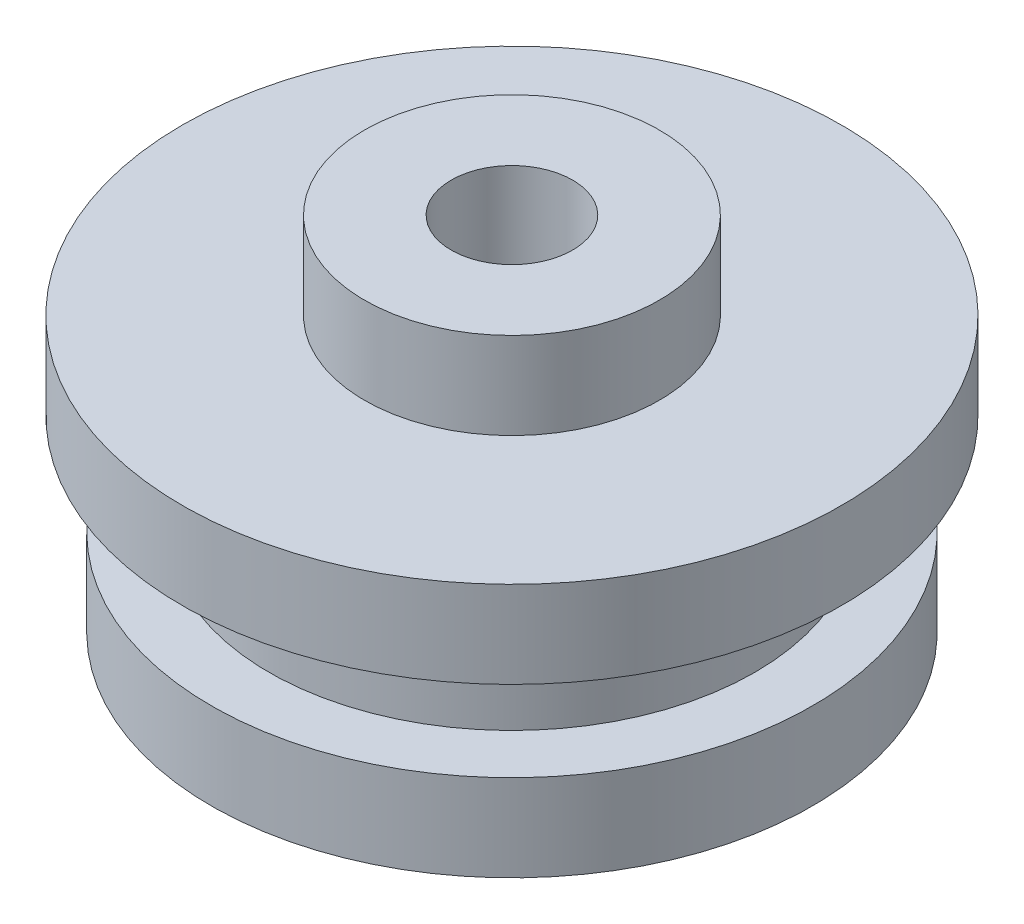
ISO-10303-21;
HEADER;
FILE_DESCRIPTION(('STEP AP214'),'2;1');
FILE_NAME('part.step','',(''),(''),'','','');
FILE_SCHEMA(('AUTOMOTIVE_DESIGN { 1 0 10303 214 1 1 1 1 }'));
ENDSEC;
DATA;
#1=APPLICATION_CONTEXT('core data for automotive mechanical design processes');
#2=APPLICATION_PROTOCOL_DEFINITION('international standard','automotive_design',2000,#1);
#3=PRODUCT_CONTEXT('',#1,'mechanical');
#4=PRODUCT('Part','Part','',(#3));
#5=PRODUCT_RELATED_PRODUCT_CATEGORY('part','',(#4));
#6=PRODUCT_DEFINITION_FORMATION('','',#4);
#7=PRODUCT_DEFINITION_CONTEXT('part definition',#1,'design');
#8=PRODUCT_DEFINITION('design','',#6,#7);
#9=PRODUCT_DEFINITION_SHAPE('','',#8);
#10=(LENGTH_UNIT() NAMED_UNIT(*) SI_UNIT(.MILLI.,.METRE.));
#11=(NAMED_UNIT(*) PLANE_ANGLE_UNIT() SI_UNIT($,.RADIAN.));
#12=(NAMED_UNIT(*) SI_UNIT($,.STERADIAN.) SOLID_ANGLE_UNIT());
#13=UNCERTAINTY_MEASURE_WITH_UNIT(LENGTH_MEASURE(1.E-05),#10,'distance_accuracy_value','');
#14=(GEOMETRIC_REPRESENTATION_CONTEXT(3) GLOBAL_UNCERTAINTY_ASSIGNED_CONTEXT((#13)) GLOBAL_UNIT_ASSIGNED_CONTEXT((#10,
#11,#12)) REPRESENTATION_CONTEXT('',''));
#15=CARTESIAN_POINT('',(0.,0.,0.));
#16=DIRECTION('',(0.,0.,1.));
#17=DIRECTION('',(1.,0.,0.));
#18=AXIS2_PLACEMENT_3D('',#15,#16,#17);
#19=CARTESIAN_POINT('',(-3.,0.,0.));
#20=DIRECTION('',(0.,1.,0.));
#21=DIRECTION('',(-1.,0.,0.));
#22=AXIS2_PLACEMENT_3D('',#19,#20,#21);
#23=PLANE('',#22);
#24=CARTESIAN_POINT('',(2.1,0.,0.));
#25=DIRECTION('',(0.,1.,0.));
#26=DIRECTION('',(-1.,0.,0.));
#27=AXIS2_PLACEMENT_3D('',#24,#25,#26);
#28=CIRCLE('',#27,5.1);
#29=CARTESIAN_POINT('',(-3.,0.,0.));
#30=VERTEX_POINT('',#29);
#31=EDGE_CURVE('E66',#30,#30,#28,.T.);
#32=ORIENTED_EDGE('',*,*,#31,.T.);
#33=EDGE_LOOP('',(#32));
#34=FACE_BOUND('',#33,.T.);
#35=CARTESIAN_POINT('',(2.1,0.,0.));
#36=DIRECTION('',(0.,1.,0.));
#37=DIRECTION('',(-1.,0.,0.));
#38=AXIS2_PLACEMENT_3D('',#35,#36,#37);
#39=CIRCLE('',#38,2.1);
#40=CARTESIAN_POINT('',(0.,0.,0.));
#41=VERTEX_POINT('',#40);
#42=EDGE_CURVE('E10',#41,#41,#39,.T.);
#43=ORIENTED_EDGE('',*,*,#42,.F.);
#44=EDGE_LOOP('',(#43));
#45=FACE_BOUND('',#44,.T.);
#46=ADVANCED_FACE('F32',(#34,#45),#23,.T.);
#47=CARTESIAN_POINT('',(2.1,0.,0.));
#48=DIRECTION('',(0.,1.,0.));
#49=DIRECTION('',(-1.,0.,0.));
#50=AXIS2_PLACEMENT_3D('',#47,#48,#49);
#51=CYLINDRICAL_SURFACE('',#50,2.1);
#52=ORIENTED_EDGE('',*,*,#42,.T.);
#53=EDGE_LOOP('',(#52));
#54=FACE_BOUND('',#53,.T.);
#55=CARTESIAN_POINT('',(2.1,-12.5,0.));
#56=DIRECTION('',(0.,1.,0.));
#57=DIRECTION('',(-1.,0.,0.));
#58=AXIS2_PLACEMENT_3D('',#55,#56,#57);
#59=CIRCLE('',#58,2.1);
#60=CARTESIAN_POINT('',(0.,-12.5,0.));
#61=VERTEX_POINT('',#60);
#62=EDGE_CURVE('E38',#61,#61,#59,.T.);
#63=ORIENTED_EDGE('',*,*,#62,.F.);
#64=EDGE_LOOP('',(#63));
#65=FACE_BOUND('',#64,.T.);
#66=ADVANCED_FACE('F84',(#54,#65),#51,.F.);
#67=CARTESIAN_POINT('',(0.,-12.5,0.));
#68=DIRECTION('',(0.,-1.,0.));
#69=DIRECTION('',(1.,0.,0.));
#70=AXIS2_PLACEMENT_3D('',#67,#68,#69);
#71=PLANE('',#70);
#72=ORIENTED_EDGE('',*,*,#62,.T.);
#73=EDGE_LOOP('',(#72));
#74=FACE_BOUND('',#73,.T.);
#75=CARTESIAN_POINT('',(2.1,-12.5,0.));
#76=DIRECTION('',(0.,1.,0.));
#77=DIRECTION('',(-1.,0.,0.));
#78=AXIS2_PLACEMENT_3D('',#75,#76,#77);
#79=CIRCLE('',#78,10.4);
#80=CARTESIAN_POINT('',(-8.3,-12.5,0.));
#81=VERTEX_POINT('',#80);
#82=EDGE_CURVE('E42',#81,#81,#79,.T.);
#83=ORIENTED_EDGE('',*,*,#82,.F.);
#84=EDGE_LOOP('',(#83));
#85=FACE_BOUND('',#84,.T.);
#86=ADVANCED_FACE('F88',(#74,#85),#71,.T.);
#87=CARTESIAN_POINT('',(2.1,0.,0.));
#88=DIRECTION('',(0.,1.,0.));
#89=DIRECTION('',(-1.,0.,0.));
#90=AXIS2_PLACEMENT_3D('',#87,#88,#89);
#91=CYLINDRICAL_SURFACE('',#90,10.4);
#92=ORIENTED_EDGE('',*,*,#82,.T.);
#93=EDGE_LOOP('',(#92));
#94=FACE_BOUND('',#93,.T.);
#95=CARTESIAN_POINT('',(2.1,-9.5,0.));
#96=DIRECTION('',(0.,1.,0.));
#97=DIRECTION('',(-1.,0.,0.));
#98=AXIS2_PLACEMENT_3D('',#95,#96,#97);
#99=CIRCLE('',#98,10.4);
#100=CARTESIAN_POINT('',(-8.3,-9.5,0.));
#101=VERTEX_POINT('',#100);
#102=EDGE_CURVE('E46',#101,#101,#99,.T.);
#103=ORIENTED_EDGE('',*,*,#102,.F.);
#104=EDGE_LOOP('',(#103));
#105=FACE_BOUND('',#104,.T.);
#106=ADVANCED_FACE('F92',(#94,#105),#91,.T.);
#107=CARTESIAN_POINT('',(-8.3,-9.5,0.));
#108=DIRECTION('',(0.,1.,0.));
#109=DIRECTION('',(-1.,0.,0.));
#110=AXIS2_PLACEMENT_3D('',#107,#108,#109);
#111=PLANE('',#110);
#112=ORIENTED_EDGE('',*,*,#102,.T.);
#113=EDGE_LOOP('',(#112));
#114=FACE_BOUND('',#113,.T.);
#115=CARTESIAN_POINT('',(2.1,-9.5,0.));
#116=DIRECTION('',(0.,1.,0.));
#117=DIRECTION('',(-1.,0.,0.));
#118=AXIS2_PLACEMENT_3D('',#115,#116,#117);
#119=CIRCLE('',#118,8.4);
#120=CARTESIAN_POINT('',(-6.3,-9.5,0.));
#121=VERTEX_POINT('',#120);
#122=EDGE_CURVE('E51',#121,#121,#119,.T.);
#123=ORIENTED_EDGE('',*,*,#122,.F.);
#124=EDGE_LOOP('',(#123));
#125=FACE_BOUND('',#124,.T.);
#126=ADVANCED_FACE('F98',(#114,#125),#111,.T.);
#127=CARTESIAN_POINT('',(2.1,0.,0.));
#128=DIRECTION('',(0.,1.,0.));
#129=DIRECTION('',(-1.,0.,0.));
#130=AXIS2_PLACEMENT_3D('',#127,#128,#129);
#131=CYLINDRICAL_SURFACE('',#130,8.4);
#132=ORIENTED_EDGE('',*,*,#122,.T.);
#133=EDGE_LOOP('',(#132));
#134=FACE_BOUND('',#133,.T.);
#135=CARTESIAN_POINT('',(2.1,-6.,0.));
#136=DIRECTION('',(0.,1.,0.));
#137=DIRECTION('',(-1.,0.,0.));
#138=AXIS2_PLACEMENT_3D('',#135,#136,#137);
#139=CIRCLE('',#138,8.4);
#140=CARTESIAN_POINT('',(-6.3,-6.,0.));
#141=VERTEX_POINT('',#140);
#142=EDGE_CURVE('E54',#141,#141,#139,.T.);
#143=ORIENTED_EDGE('',*,*,#142,.F.);
#144=EDGE_LOOP('',(#143));
#145=FACE_BOUND('',#144,.T.);
#146=ADVANCED_FACE('F102',(#134,#145),#131,.T.);
#147=CARTESIAN_POINT('',(-6.3,-6.,0.));
#148=DIRECTION('',(0.,-1.,0.));
#149=DIRECTION('',(1.,0.,0.));
#150=AXIS2_PLACEMENT_3D('',#147,#148,#149);
#151=PLANE('',#150);
#152=ORIENTED_EDGE('',*,*,#142,.T.);
#153=EDGE_LOOP('',(#152));
#154=FACE_BOUND('',#153,.T.);
#155=CARTESIAN_POINT('',(2.1,-6.,0.));
#156=DIRECTION('',(0.,1.,0.));
#157=DIRECTION('',(-1.,0.,0.));
#158=AXIS2_PLACEMENT_3D('',#155,#156,#157);
#159=CIRCLE('',#158,11.4);
#160=CARTESIAN_POINT('',(-9.3,-6.,0.));
#161=VERTEX_POINT('',#160);
#162=EDGE_CURVE('E57',#161,#161,#159,.T.);
#163=ORIENTED_EDGE('',*,*,#162,.F.);
#164=EDGE_LOOP('',(#163));
#165=FACE_BOUND('',#164,.T.);
#166=ADVANCED_FACE('F106',(#154,#165),#151,.T.);
#167=CARTESIAN_POINT('',(2.1,0.,0.));
#168=DIRECTION('',(0.,1.,0.));
#169=DIRECTION('',(-1.,0.,0.));
#170=AXIS2_PLACEMENT_3D('',#167,#168,#169);
#171=CYLINDRICAL_SURFACE('',#170,11.4);
#172=ORIENTED_EDGE('',*,*,#162,.T.);
#173=EDGE_LOOP('',(#172));
#174=FACE_BOUND('',#173,.T.);
#175=CARTESIAN_POINT('',(2.1,-3.,0.));
#176=DIRECTION('',(0.,1.,0.));
#177=DIRECTION('',(-1.,0.,0.));
#178=AXIS2_PLACEMENT_3D('',#175,#176,#177);
#179=CIRCLE('',#178,11.4);
#180=CARTESIAN_POINT('',(-9.3,-3.,0.));
#181=VERTEX_POINT('',#180);
#182=EDGE_CURVE('E60',#181,#181,#179,.T.);
#183=ORIENTED_EDGE('',*,*,#182,.F.);
#184=EDGE_LOOP('',(#183));
#185=FACE_BOUND('',#184,.T.);
#186=ADVANCED_FACE('F80',(#174,#185),#171,.T.);
#187=CARTESIAN_POINT('',(-9.3,-3.,0.));
#188=DIRECTION('',(0.,1.,0.));
#189=DIRECTION('',(-1.,0.,0.));
#190=AXIS2_PLACEMENT_3D('',#187,#188,#189);
#191=PLANE('',#190);
#192=ORIENTED_EDGE('',*,*,#182,.T.);
#193=EDGE_LOOP('',(#192));
#194=FACE_BOUND('',#193,.T.);
#195=CARTESIAN_POINT('',(2.1,-3.,0.));
#196=DIRECTION('',(0.,1.,0.));
#197=DIRECTION('',(-1.,0.,0.));
#198=AXIS2_PLACEMENT_3D('',#195,#196,#197);
#199=CIRCLE('',#198,5.1);
#200=CARTESIAN_POINT('',(-3.,-3.,0.));
#201=VERTEX_POINT('',#200);
#202=EDGE_CURVE('E63',#201,#201,#199,.T.);
#203=ORIENTED_EDGE('',*,*,#202,.F.);
#204=EDGE_LOOP('',(#203));
#205=FACE_BOUND('',#204,.T.);
#206=ADVANCED_FACE('F74',(#194,#205),#191,.T.);
#207=CARTESIAN_POINT('',(2.1,0.,0.));
#208=DIRECTION('',(0.,1.,0.));
#209=DIRECTION('',(-1.,0.,0.));
#210=AXIS2_PLACEMENT_3D('',#207,#208,#209);
#211=CYLINDRICAL_SURFACE('',#210,5.1);
#212=ORIENTED_EDGE('',*,*,#202,.T.);
#213=EDGE_LOOP('',(#212));
#214=FACE_BOUND('',#213,.T.);
#215=ORIENTED_EDGE('',*,*,#31,.F.);
#216=EDGE_LOOP('',(#215));
#217=FACE_BOUND('',#216,.T.);
#218=ADVANCED_FACE('F72',(#214,#217),#211,.T.);
#219=CLOSED_SHELL('',(#46,#66,#86,#106,#126,#146,#166,#186,#206,#218));
#220=MANIFOLD_SOLID_BREP('B2',#219);
#221=ADVANCED_BREP_SHAPE_REPRESENTATION('',(#18,#220),#14);
#222=SHAPE_DEFINITION_REPRESENTATION(#9,#221);
ENDSEC;
END-ISO-10303-21;
